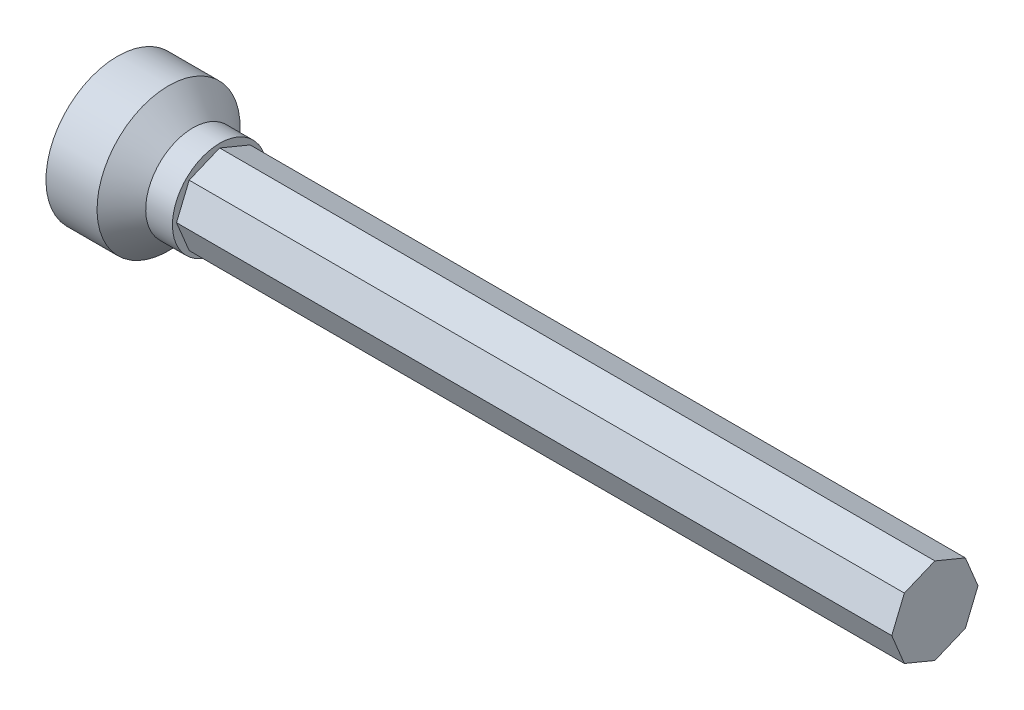
ISO-10303-21;
HEADER;
FILE_DESCRIPTION(('STEP AP214'),'2;1');
FILE_NAME('part.step','',(''),(''),'','','');
FILE_SCHEMA(('AUTOMOTIVE_DESIGN { 1 0 10303 214 1 1 1 1 }'));
ENDSEC;
DATA;
#1=APPLICATION_CONTEXT('core data for automotive mechanical design processes');
#2=APPLICATION_PROTOCOL_DEFINITION('international standard','automotive_design',2000,#1);
#3=PRODUCT_CONTEXT('',#1,'mechanical');
#4=PRODUCT('Part','Part','',(#3));
#5=PRODUCT_RELATED_PRODUCT_CATEGORY('part','',(#4));
#6=PRODUCT_DEFINITION_FORMATION('','',#4);
#7=PRODUCT_DEFINITION_CONTEXT('part definition',#1,'design');
#8=PRODUCT_DEFINITION('design','',#6,#7);
#9=PRODUCT_DEFINITION_SHAPE('','',#8);
#10=(LENGTH_UNIT() NAMED_UNIT(*) SI_UNIT(.MILLI.,.METRE.));
#11=(NAMED_UNIT(*) PLANE_ANGLE_UNIT() SI_UNIT($,.RADIAN.));
#12=(NAMED_UNIT(*) SI_UNIT($,.STERADIAN.) SOLID_ANGLE_UNIT());
#13=UNCERTAINTY_MEASURE_WITH_UNIT(LENGTH_MEASURE(1.E-05),#10,'distance_accuracy_value','');
#14=(GEOMETRIC_REPRESENTATION_CONTEXT(3) GLOBAL_UNCERTAINTY_ASSIGNED_CONTEXT((#13)) GLOBAL_UNIT_ASSIGNED_CONTEXT((#10,
#11,#12)) REPRESENTATION_CONTEXT('',''));
#15=CARTESIAN_POINT('',(0.,0.,0.));
#16=DIRECTION('',(0.,0.,1.));
#17=DIRECTION('',(1.,0.,0.));
#18=AXIS2_PLACEMENT_3D('',#15,#16,#17);
#19=CARTESIAN_POINT('',(35.,1.49246538622384,1.49246538622386));
#20=DIRECTION('',(0.,-0.382683432365084,-0.923879532511289));
#21=DIRECTION('',(0.,0.923879532511289,-0.382683432365084));
#22=AXIS2_PLACEMENT_3D('',#19,#20,#21);
#23=PLANE('',#22);
#24=DIRECTION('',(0.,-0.923879532511289,0.382683432365084));
#25=VECTOR('',#24,1.);
#26=CARTESIAN_POINT('',(0.,1.49246538622384,1.49246538622386));
#27=LINE('',#26,#25);
#28=CARTESIAN_POINT('',(0.,1.49246538622384,1.49246538622386));
#29=VERTEX_POINT('',#28);
#30=CARTESIAN_POINT('',(0.,0.,2.11066479057017));
#31=VERTEX_POINT('',#30);
#32=EDGE_CURVE('E109',#29,#31,#27,.T.);
#33=ORIENTED_EDGE('',*,*,#32,.T.);
#34=DIRECTION('',(-1.,0.,0.));
#35=VECTOR('',#34,1.);
#36=CARTESIAN_POINT('',(35.,0.,2.11066479057017));
#37=LINE('',#36,#35);
#38=CARTESIAN_POINT('',(35.,0.,2.11066479057017));
#39=VERTEX_POINT('',#38);
#40=EDGE_CURVE('E11',#39,#31,#37,.T.);
#41=ORIENTED_EDGE('',*,*,#40,.F.);
#42=DIRECTION('',(0.,-0.923879532511289,0.382683432365084));
#43=VECTOR('',#42,1.);
#44=CARTESIAN_POINT('',(35.,1.49246538622384,1.49246538622386));
#45=LINE('',#44,#43);
#46=CARTESIAN_POINT('',(35.,1.49246538622384,1.49246538622386));
#47=VERTEX_POINT('',#46);
#48=EDGE_CURVE('E156',#47,#39,#45,.T.);
#49=ORIENTED_EDGE('',*,*,#48,.F.);
#50=DIRECTION('',(-1.,0.,0.));
#51=VECTOR('',#50,1.);
#52=CARTESIAN_POINT('',(35.,1.49246538622384,1.49246538622386));
#53=LINE('',#52,#51);
#54=EDGE_CURVE('E124',#47,#29,#53,.T.);
#55=ORIENTED_EDGE('',*,*,#54,.T.);
#56=EDGE_LOOP('',(#33,#41,#49,#55));
#57=FACE_BOUND('',#56,.T.);
#58=ADVANCED_FACE('F45',(#57),#23,.F.);
#59=CARTESIAN_POINT('',(35.,0.,2.11066479057017));
#60=DIRECTION('',(0.,0.382683432365096,-0.923879532511284));
#61=DIRECTION('',(0.,0.923879532511284,0.382683432365096));
#62=AXIS2_PLACEMENT_3D('',#59,#60,#61);
#63=PLANE('',#62);
#64=DIRECTION('',(0.,-0.923879532511284,-0.382683432365096));
#65=VECTOR('',#64,1.);
#66=CARTESIAN_POINT('',(0.,0.,2.11066479057017));
#67=LINE('',#66,#65);
#68=CARTESIAN_POINT('',(0.,-1.49246538622386,1.49246538622384));
#69=VERTEX_POINT('',#68);
#70=EDGE_CURVE('E106',#31,#69,#67,.T.);
#71=ORIENTED_EDGE('',*,*,#70,.T.);
#72=DIRECTION('',(-1.,0.,0.));
#73=VECTOR('',#72,1.);
#74=CARTESIAN_POINT('',(35.,-1.49246538622386,1.49246538622384));
#75=LINE('',#74,#73);
#76=CARTESIAN_POINT('',(35.,-1.49246538622386,1.49246538622384));
#77=VERTEX_POINT('',#76);
#78=EDGE_CURVE('E54',#77,#69,#75,.T.);
#79=ORIENTED_EDGE('',*,*,#78,.F.);
#80=DIRECTION('',(0.,-0.923879532511284,-0.382683432365096));
#81=VECTOR('',#80,1.);
#82=CARTESIAN_POINT('',(35.,0.,2.11066479057017));
#83=LINE('',#82,#81);
#84=EDGE_CURVE('E120',#39,#77,#83,.T.);
#85=ORIENTED_EDGE('',*,*,#84,.F.);
#86=ORIENTED_EDGE('',*,*,#40,.T.);
#87=EDGE_LOOP('',(#71,#79,#85,#86));
#88=FACE_BOUND('',#87,.T.);
#89=ADVANCED_FACE('F119',(#88),#63,.F.);
#90=CARTESIAN_POINT('',(35.,-1.49246538622386,1.49246538622384));
#91=DIRECTION('',(0.,0.923879532511289,-0.382683432365084));
#92=DIRECTION('',(0.,0.382683432365084,0.923879532511289));
#93=AXIS2_PLACEMENT_3D('',#90,#91,#92);
#94=PLANE('',#93);
#95=DIRECTION('',(0.,-0.382683432365084,-0.923879532511289));
#96=VECTOR('',#95,1.);
#97=CARTESIAN_POINT('',(0.,-1.49246538622386,1.49246538622384));
#98=LINE('',#97,#96);
#99=CARTESIAN_POINT('',(0.,-2.11066479057017,0.));
#100=VERTEX_POINT('',#99);
#101=EDGE_CURVE('E112',#69,#100,#98,.T.);
#102=ORIENTED_EDGE('',*,*,#101,.T.);
#103=DIRECTION('',(-1.,0.,0.));
#104=VECTOR('',#103,1.);
#105=CARTESIAN_POINT('',(35.,-2.11066479057017,0.));
#106=LINE('',#105,#104);
#107=CARTESIAN_POINT('',(35.,-2.11066479057017,0.));
#108=VERTEX_POINT('',#107);
#109=EDGE_CURVE('E175',#108,#100,#106,.T.);
#110=ORIENTED_EDGE('',*,*,#109,.F.);
#111=DIRECTION('',(0.,-0.382683432365084,-0.923879532511289));
#112=VECTOR('',#111,1.);
#113=CARTESIAN_POINT('',(35.,-1.49246538622386,1.49246538622384));
#114=LINE('',#113,#112);
#115=EDGE_CURVE('E183',#77,#108,#114,.T.);
#116=ORIENTED_EDGE('',*,*,#115,.F.);
#117=ORIENTED_EDGE('',*,*,#78,.T.);
#118=EDGE_LOOP('',(#102,#110,#116,#117));
#119=FACE_BOUND('',#118,.T.);
#120=ADVANCED_FACE('F181',(#119),#94,.F.);
#121=CARTESIAN_POINT('',(35.,-2.11066479057017,0.));
#122=DIRECTION('',(0.,0.923879532511284,0.382683432365096));
#123=DIRECTION('',(0.,-0.382683432365096,0.923879532511284));
#124=AXIS2_PLACEMENT_3D('',#121,#122,#123);
#125=PLANE('',#124);
#126=DIRECTION('',(0.,0.382683432365096,-0.923879532511284));
#127=VECTOR('',#126,1.);
#128=CARTESIAN_POINT('',(0.,-2.11066479057017,0.));
#129=LINE('',#128,#127);
#130=CARTESIAN_POINT('',(0.,-1.49246538622384,-1.49246538622386));
#131=VERTEX_POINT('',#130);
#132=EDGE_CURVE('E137',#100,#131,#129,.T.);
#133=ORIENTED_EDGE('',*,*,#132,.T.);
#134=DIRECTION('',(-1.,0.,0.));
#135=VECTOR('',#134,1.);
#136=CARTESIAN_POINT('',(35.,-1.49246538622384,-1.49246538622386));
#137=LINE('',#136,#135);
#138=CARTESIAN_POINT('',(35.,-1.49246538622384,-1.49246538622386));
#139=VERTEX_POINT('',#138);
#140=EDGE_CURVE('E171',#139,#131,#137,.T.);
#141=ORIENTED_EDGE('',*,*,#140,.F.);
#142=DIRECTION('',(0.,0.382683432365096,-0.923879532511284));
#143=VECTOR('',#142,1.);
#144=CARTESIAN_POINT('',(35.,-2.11066479057017,0.));
#145=LINE('',#144,#143);
#146=EDGE_CURVE('E186',#108,#139,#145,.T.);
#147=ORIENTED_EDGE('',*,*,#146,.F.);
#148=ORIENTED_EDGE('',*,*,#109,.T.);
#149=EDGE_LOOP('',(#133,#141,#147,#148));
#150=FACE_BOUND('',#149,.T.);
#151=ADVANCED_FACE('F245',(#150),#125,.F.);
#152=CARTESIAN_POINT('',(35.,-1.49246538622384,-1.49246538622386));
#153=DIRECTION('',(0.,0.382683432365084,0.923879532511289));
#154=DIRECTION('',(0.,-0.923879532511289,0.382683432365084));
#155=AXIS2_PLACEMENT_3D('',#152,#153,#154);
#156=PLANE('',#155);
#157=DIRECTION('',(0.,0.923879532511289,-0.382683432365084));
#158=VECTOR('',#157,1.);
#159=CARTESIAN_POINT('',(0.,-1.49246538622384,-1.49246538622386));
#160=LINE('',#159,#158);
#161=CARTESIAN_POINT('',(0.,0.,-2.11066479057017));
#162=VERTEX_POINT('',#161);
#163=EDGE_CURVE('E141',#131,#162,#160,.T.);
#164=ORIENTED_EDGE('',*,*,#163,.T.);
#165=DIRECTION('',(-1.,0.,0.));
#166=VECTOR('',#165,1.);
#167=CARTESIAN_POINT('',(35.,0.,-2.11066479057017));
#168=LINE('',#167,#166);
#169=CARTESIAN_POINT('',(35.,0.,-2.11066479057017));
#170=VERTEX_POINT('',#169);
#171=EDGE_CURVE('E167',#170,#162,#168,.T.);
#172=ORIENTED_EDGE('',*,*,#171,.F.);
#173=DIRECTION('',(0.,0.923879532511289,-0.382683432365084));
#174=VECTOR('',#173,1.);
#175=CARTESIAN_POINT('',(35.,-1.49246538622384,-1.49246538622386));
#176=LINE('',#175,#174);
#177=EDGE_CURVE('E190',#139,#170,#176,.T.);
#178=ORIENTED_EDGE('',*,*,#177,.F.);
#179=ORIENTED_EDGE('',*,*,#140,.T.);
#180=EDGE_LOOP('',(#164,#172,#178,#179));
#181=FACE_BOUND('',#180,.T.);
#182=ADVANCED_FACE('F250',(#181),#156,.F.);
#183=CARTESIAN_POINT('',(35.,0.,-2.11066479057017));
#184=DIRECTION('',(0.,-0.382683432365096,0.923879532511284));
#185=DIRECTION('',(0.,-0.923879532511284,-0.382683432365096));
#186=AXIS2_PLACEMENT_3D('',#183,#184,#185);
#187=PLANE('',#186);
#188=DIRECTION('',(0.,0.923879532511284,0.382683432365096));
#189=VECTOR('',#188,1.);
#190=CARTESIAN_POINT('',(0.,0.,-2.11066479057017));
#191=LINE('',#190,#189);
#192=CARTESIAN_POINT('',(0.,1.49246538622386,-1.49246538622384));
#193=VERTEX_POINT('',#192);
#194=EDGE_CURVE('E145',#162,#193,#191,.T.);
#195=ORIENTED_EDGE('',*,*,#194,.T.);
#196=DIRECTION('',(-1.,0.,0.));
#197=VECTOR('',#196,1.);
#198=CARTESIAN_POINT('',(35.,1.49246538622386,-1.49246538622384));
#199=LINE('',#198,#197);
#200=CARTESIAN_POINT('',(35.,1.49246538622386,-1.49246538622384));
#201=VERTEX_POINT('',#200);
#202=EDGE_CURVE('E163',#201,#193,#199,.T.);
#203=ORIENTED_EDGE('',*,*,#202,.F.);
#204=DIRECTION('',(0.,0.923879532511284,0.382683432365096));
#205=VECTOR('',#204,1.);
#206=CARTESIAN_POINT('',(35.,0.,-2.11066479057017));
#207=LINE('',#206,#205);
#208=EDGE_CURVE('E197',#170,#201,#207,.T.);
#209=ORIENTED_EDGE('',*,*,#208,.F.);
#210=ORIENTED_EDGE('',*,*,#171,.T.);
#211=EDGE_LOOP('',(#195,#203,#209,#210));
#212=FACE_BOUND('',#211,.T.);
#213=ADVANCED_FACE('F254',(#212),#187,.F.);
#214=CARTESIAN_POINT('',(35.,1.49246538622386,-1.49246538622384));
#215=DIRECTION('',(0.,-0.923879532511289,0.382683432365084));
#216=DIRECTION('',(0.,-0.382683432365084,-0.923879532511289));
#217=AXIS2_PLACEMENT_3D('',#214,#215,#216);
#218=PLANE('',#217);
#219=DIRECTION('',(0.,0.382683432365084,0.923879532511289));
#220=VECTOR('',#219,1.);
#221=CARTESIAN_POINT('',(0.,1.49246538622386,-1.49246538622384));
#222=LINE('',#221,#220);
#223=CARTESIAN_POINT('',(0.,2.11066479057017,0.));
#224=VERTEX_POINT('',#223);
#225=EDGE_CURVE('E149',#193,#224,#222,.T.);
#226=ORIENTED_EDGE('',*,*,#225,.T.);
#227=DIRECTION('',(-1.,0.,0.));
#228=VECTOR('',#227,1.);
#229=CARTESIAN_POINT('',(35.,2.11066479057017,0.));
#230=LINE('',#229,#228);
#231=CARTESIAN_POINT('',(35.,2.11066479057017,0.));
#232=VERTEX_POINT('',#231);
#233=EDGE_CURVE('E159',#232,#224,#230,.T.);
#234=ORIENTED_EDGE('',*,*,#233,.F.);
#235=DIRECTION('',(0.,0.382683432365084,0.923879532511289));
#236=VECTOR('',#235,1.);
#237=CARTESIAN_POINT('',(35.,1.49246538622386,-1.49246538622384));
#238=LINE('',#237,#236);
#239=EDGE_CURVE('E199',#201,#232,#238,.T.);
#240=ORIENTED_EDGE('',*,*,#239,.F.);
#241=ORIENTED_EDGE('',*,*,#202,.T.);
#242=EDGE_LOOP('',(#226,#234,#240,#241));
#243=FACE_BOUND('',#242,.T.);
#244=ADVANCED_FACE('F208',(#243),#218,.F.);
#245=CARTESIAN_POINT('',(35.,2.11066479057017,0.));
#246=DIRECTION('',(0.,-0.923879532511284,-0.382683432365096));
#247=DIRECTION('',(0.,0.382683432365096,-0.923879532511284));
#248=AXIS2_PLACEMENT_3D('',#245,#246,#247);
#249=PLANE('',#248);
#250=DIRECTION('',(0.,-0.382683432365096,0.923879532511284));
#251=VECTOR('',#250,1.);
#252=CARTESIAN_POINT('',(0.,2.11066479057017,0.));
#253=LINE('',#252,#251);
#254=EDGE_CURVE('E153',#224,#29,#253,.T.);
#255=ORIENTED_EDGE('',*,*,#254,.T.);
#256=ORIENTED_EDGE('',*,*,#54,.F.);
#257=DIRECTION('',(0.,-0.382683432365096,0.923879532511284));
#258=VECTOR('',#257,1.);
#259=CARTESIAN_POINT('',(35.,2.11066479057017,0.));
#260=LINE('',#259,#258);
#261=EDGE_CURVE('E61',#232,#47,#260,.T.);
#262=ORIENTED_EDGE('',*,*,#261,.F.);
#263=ORIENTED_EDGE('',*,*,#233,.T.);
#264=EDGE_LOOP('',(#255,#256,#262,#263));
#265=FACE_BOUND('',#264,.T.);
#266=ADVANCED_FACE('F210',(#265),#249,.F.);
#267=CARTESIAN_POINT('',(35.,0.,0.));
#268=DIRECTION('',(1.,0.,0.));
#269=DIRECTION('',(0.,0.,-1.));
#270=AXIS2_PLACEMENT_3D('',#267,#268,#269);
#271=PLANE('',#270);
#272=ORIENTED_EDGE('',*,*,#48,.T.);
#273=ORIENTED_EDGE('',*,*,#84,.T.);
#274=ORIENTED_EDGE('',*,*,#115,.T.);
#275=ORIENTED_EDGE('',*,*,#146,.T.);
#276=ORIENTED_EDGE('',*,*,#177,.T.);
#277=ORIENTED_EDGE('',*,*,#208,.T.);
#278=ORIENTED_EDGE('',*,*,#239,.T.);
#279=ORIENTED_EDGE('',*,*,#261,.T.);
#280=EDGE_LOOP('',(#272,#273,#274,#275,#276,#277,#278,#279));
#281=FACE_BOUND('',#280,.T.);
#282=ADVANCED_FACE('F204',(#281),#271,.T.);
#283=CARTESIAN_POINT('',(0.,2.3094010767585,0.));
#284=DIRECTION('',(1.,0.,0.));
#285=DIRECTION('',(0.,1.,0.));
#286=AXIS2_PLACEMENT_3D('',#283,#284,#285);
#287=PLANE('',#286);
#288=CARTESIAN_POINT('',(0.,0.,0.));
#289=DIRECTION('',(1.,0.,0.));
#290=DIRECTION('',(0.,1.,0.));
#291=AXIS2_PLACEMENT_3D('',#288,#289,#290);
#292=CIRCLE('',#291,2.3094010767585);
#293=CARTESIAN_POINT('',(0.,2.3094010767585,0.));
#294=VERTEX_POINT('',#293);
#295=EDGE_CURVE('E220',#294,#294,#292,.T.);
#296=ORIENTED_EDGE('',*,*,#295,.T.);
#297=EDGE_LOOP('',(#296));
#298=FACE_BOUND('',#297,.T.);
#299=ORIENTED_EDGE('',*,*,#32,.F.);
#300=ORIENTED_EDGE('',*,*,#254,.F.);
#301=ORIENTED_EDGE('',*,*,#225,.F.);
#302=ORIENTED_EDGE('',*,*,#194,.F.);
#303=ORIENTED_EDGE('',*,*,#163,.F.);
#304=ORIENTED_EDGE('',*,*,#132,.F.);
#305=ORIENTED_EDGE('',*,*,#101,.F.);
#306=ORIENTED_EDGE('',*,*,#70,.F.);
#307=EDGE_LOOP('',(#299,#300,#301,#302,#303,#304,#305,#306));
#308=FACE_BOUND('',#307,.T.);
#309=ADVANCED_FACE('F107',(#298,#308),#287,.T.);
#310=CARTESIAN_POINT('',(-5.,0.,0.));
#311=DIRECTION('',(-1.,0.,0.));
#312=DIRECTION('',(0.,-1.,0.));
#313=AXIS2_PLACEMENT_3D('',#310,#311,#312);
#314=PLANE('',#313);
#315=CARTESIAN_POINT('',(-5.,0.,0.));
#316=DIRECTION('',(1.,0.,0.));
#317=DIRECTION('',(0.,1.,0.));
#318=AXIS2_PLACEMENT_3D('',#315,#316,#317);
#319=CIRCLE('',#318,3.5);
#320=CARTESIAN_POINT('',(-5.,3.5,0.));
#321=VERTEX_POINT('',#320);
#322=EDGE_CURVE('E126',#321,#321,#319,.T.);
#323=ORIENTED_EDGE('',*,*,#322,.F.);
#324=EDGE_LOOP('',(#323));
#325=FACE_BOUND('',#324,.T.);
#326=ADVANCED_FACE('F266',(#325),#314,.T.);
#327=CARTESIAN_POINT('',(0.,0.,0.));
#328=DIRECTION('',(1.,0.,0.));
#329=DIRECTION('',(0.,1.,0.));
#330=AXIS2_PLACEMENT_3D('',#327,#328,#329);
#331=CYLINDRICAL_SURFACE('',#330,3.5);
#332=ORIENTED_EDGE('',*,*,#322,.T.);
#333=EDGE_LOOP('',(#332));
#334=FACE_BOUND('',#333,.T.);
#335=CARTESIAN_POINT('',(-2.5,0.,0.));
#336=DIRECTION('',(1.,0.,0.));
#337=DIRECTION('',(0.,1.,0.));
#338=AXIS2_PLACEMENT_3D('',#335,#336,#337);
#339=CIRCLE('',#338,3.5);
#340=CARTESIAN_POINT('',(-2.5,3.5,0.));
#341=VERTEX_POINT('',#340);
#342=EDGE_CURVE('E130',#341,#341,#339,.T.);
#343=ORIENTED_EDGE('',*,*,#342,.F.);
#344=EDGE_LOOP('',(#343));
#345=FACE_BOUND('',#344,.T.);
#346=ADVANCED_FACE('F234',(#334,#345),#331,.T.);
#347=CARTESIAN_POINT('',(-1.3094010767585,0.,0.));
#348=DIRECTION('',(-1.,0.,0.));
#349=DIRECTION('',(0.,-1.,0.));
#350=AXIS2_PLACEMENT_3D('',#347,#348,#349);
#351=CONICAL_SURFACE('',#350,2.3094010767585,0.785398163397449);
#352=ORIENTED_EDGE('',*,*,#342,.T.);
#353=EDGE_LOOP('',(#352));
#354=FACE_BOUND('',#353,.T.);
#355=CARTESIAN_POINT('',(-1.3094010767585,0.,0.));
#356=DIRECTION('',(1.,0.,0.));
#357=DIRECTION('',(0.,1.,0.));
#358=AXIS2_PLACEMENT_3D('',#355,#356,#357);
#359=CIRCLE('',#358,2.3094010767585);
#360=CARTESIAN_POINT('',(-1.3094010767585,2.3094010767585,0.));
#361=VERTEX_POINT('',#360);
#362=EDGE_CURVE('E216',#361,#361,#359,.T.);
#363=ORIENTED_EDGE('',*,*,#362,.F.);
#364=EDGE_LOOP('',(#363));
#365=FACE_BOUND('',#364,.T.);
#366=ADVANCED_FACE('F228',(#354,#365),#351,.T.);
#367=CARTESIAN_POINT('',(0.,0.,0.));
#368=DIRECTION('',(1.,0.,0.));
#369=DIRECTION('',(0.,1.,0.));
#370=AXIS2_PLACEMENT_3D('',#367,#368,#369);
#371=CYLINDRICAL_SURFACE('',#370,2.3094010767585);
#372=ORIENTED_EDGE('',*,*,#362,.T.);
#373=EDGE_LOOP('',(#372));
#374=FACE_BOUND('',#373,.T.);
#375=ORIENTED_EDGE('',*,*,#295,.F.);
#376=EDGE_LOOP('',(#375));
#377=FACE_BOUND('',#376,.T.);
#378=ADVANCED_FACE('F226',(#374,#377),#371,.T.);
#379=CLOSED_SHELL('',(#58,#89,#120,#151,#182,#213,#244,#266,#282,#309,#326,#346,#366,#378));
#380=MANIFOLD_SOLID_BREP('B2',#379);
#381=ADVANCED_BREP_SHAPE_REPRESENTATION('',(#18,#380),#14);
#382=SHAPE_DEFINITION_REPRESENTATION(#9,#381);
ENDSEC;
END-ISO-10303-21;
